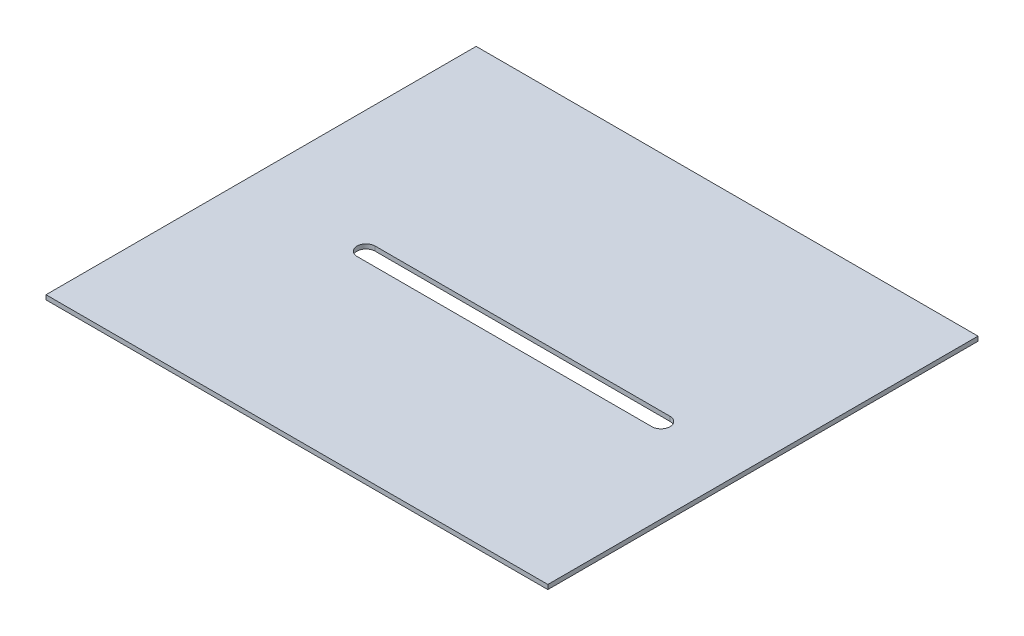
ISO-10303-21;
HEADER;
FILE_DESCRIPTION(('STEP AP214'),'2;1');
FILE_NAME('part.step','',(''),(''),'','','');
FILE_SCHEMA(('AUTOMOTIVE_DESIGN { 1 0 10303 214 1 1 1 1 }'));
ENDSEC;
DATA;
#1=APPLICATION_CONTEXT('core data for automotive mechanical design processes');
#2=APPLICATION_PROTOCOL_DEFINITION('international standard','automotive_design',2000,#1);
#3=PRODUCT_CONTEXT('',#1,'mechanical');
#4=PRODUCT('Part','Part','',(#3));
#5=PRODUCT_RELATED_PRODUCT_CATEGORY('part','',(#4));
#6=PRODUCT_DEFINITION_FORMATION('','',#4);
#7=PRODUCT_DEFINITION_CONTEXT('part definition',#1,'design');
#8=PRODUCT_DEFINITION('design','',#6,#7);
#9=PRODUCT_DEFINITION_SHAPE('','',#8);
#10=(LENGTH_UNIT() NAMED_UNIT(*) SI_UNIT(.MILLI.,.METRE.));
#11=(NAMED_UNIT(*) PLANE_ANGLE_UNIT() SI_UNIT($,.RADIAN.));
#12=(NAMED_UNIT(*) SI_UNIT($,.STERADIAN.) SOLID_ANGLE_UNIT());
#13=UNCERTAINTY_MEASURE_WITH_UNIT(LENGTH_MEASURE(1.E-05),#10,'distance_accuracy_value','');
#14=(GEOMETRIC_REPRESENTATION_CONTEXT(3) GLOBAL_UNCERTAINTY_ASSIGNED_CONTEXT((#13)) GLOBAL_UNIT_ASSIGNED_CONTEXT((#10,
#11,#12)) REPRESENTATION_CONTEXT('',''));
#15=CARTESIAN_POINT('',(0.,0.,0.));
#16=DIRECTION('',(0.,0.,1.));
#17=DIRECTION('',(1.,0.,0.));
#18=AXIS2_PLACEMENT_3D('',#15,#16,#17);
#19=CARTESIAN_POINT('',(0.,3.175,0.));
#20=DIRECTION('',(0.,-1.,0.));
#21=DIRECTION('',(0.,0.,-1.));
#22=AXIS2_PLACEMENT_3D('',#19,#20,#21);
#23=PLANE('',#22);
#24=DIRECTION('',(0.,0.,1.));
#25=VECTOR('',#24,1.);
#26=CARTESIAN_POINT('',(0.,3.175,0.));
#27=LINE('',#26,#25);
#28=CARTESIAN_POINT('',(0.,3.175,-304.8));
#29=VERTEX_POINT('',#28);
#30=CARTESIAN_POINT('',(0.,3.175,0.));
#31=VERTEX_POINT('',#30);
#32=EDGE_CURVE('E134',#29,#31,#27,.T.);
#33=ORIENTED_EDGE('',*,*,#32,.T.);
#34=DIRECTION('',(1.,0.,0.));
#35=VECTOR('',#34,1.);
#36=CARTESIAN_POINT('',(0.,3.175,0.));
#37=LINE('',#36,#35);
#38=CARTESIAN_POINT('',(355.6,3.175,0.));
#39=VERTEX_POINT('',#38);
#40=EDGE_CURVE('E137',#31,#39,#37,.T.);
#41=ORIENTED_EDGE('',*,*,#40,.T.);
#42=DIRECTION('',(0.,0.,-1.));
#43=VECTOR('',#42,1.);
#44=CARTESIAN_POINT('',(355.6,3.175,0.));
#45=LINE('',#44,#43);
#46=CARTESIAN_POINT('',(355.6,3.175,-304.8));
#47=VERTEX_POINT('',#46);
#48=EDGE_CURVE('E140',#39,#47,#45,.T.);
#49=ORIENTED_EDGE('',*,*,#48,.T.);
#50=DIRECTION('',(-1.,0.,0.));
#51=VECTOR('',#50,1.);
#52=CARTESIAN_POINT('',(0.,3.175,-304.8));
#53=LINE('',#52,#51);
#54=EDGE_CURVE('E142',#47,#29,#53,.T.);
#55=ORIENTED_EDGE('',*,*,#54,.T.);
#56=EDGE_LOOP('',(#33,#41,#49,#55));
#57=FACE_BOUND('',#56,.T.);
#58=CARTESIAN_POINT('',(295.660266997729,3.175,-140.090080016851));
#59=DIRECTION('',(0.,1.,0.));
#60=DIRECTION('',(0.,0.,1.));
#61=AXIS2_PLACEMENT_3D('',#58,#59,#60);
#62=CIRCLE('',#61,6.41055384885193);
#63=CARTESIAN_POINT('',(295.660266997729,3.175,-133.679526167999));
#64=VERTEX_POINT('',#63);
#65=CARTESIAN_POINT('',(295.660266997729,3.175,-146.500633865703));
#66=VERTEX_POINT('',#65);
#67=EDGE_CURVE('E98',#64,#66,#62,.T.);
#68=ORIENTED_EDGE('',*,*,#67,.F.);
#69=DIRECTION('',(1.,0.,0.));
#70=VECTOR('',#69,1.);
#71=CARTESIAN_POINT('',(295.660266997729,3.175,-133.679526167999));
#72=LINE('',#71,#70);
#73=CARTESIAN_POINT('',(86.717406579238,3.175,-133.679526167999));
#74=VERTEX_POINT('',#73);
#75=EDGE_CURVE('E120',#74,#64,#72,.T.);
#76=ORIENTED_EDGE('',*,*,#75,.F.);
#77=CARTESIAN_POINT('',(86.717406579238,3.175,-140.090080016851));
#78=DIRECTION('',(0.,1.,0.));
#79=DIRECTION('',(0.,0.,1.));
#80=AXIS2_PLACEMENT_3D('',#77,#78,#79);
#81=CIRCLE('',#80,6.4105538488519);
#82=CARTESIAN_POINT('',(86.717406579238,3.175,-146.500633865703));
#83=VERTEX_POINT('',#82);
#84=EDGE_CURVE('E118',#83,#74,#81,.T.);
#85=ORIENTED_EDGE('',*,*,#84,.F.);
#86=DIRECTION('',(-1.,0.,0.));
#87=VECTOR('',#86,1.);
#88=CARTESIAN_POINT('',(295.660266997729,3.175,-146.500633865703));
#89=LINE('',#88,#87);
#90=EDGE_CURVE('E106',#66,#83,#89,.T.);
#91=ORIENTED_EDGE('',*,*,#90,.F.);
#92=EDGE_LOOP('',(#68,#76,#85,#91));
#93=FACE_BOUND('',#92,.T.);
#94=ADVANCED_FACE('F33',(#57,#93),#23,.F.);
#95=CARTESIAN_POINT('',(0.,0.,0.));
#96=DIRECTION('',(0.,-1.,0.));
#97=DIRECTION('',(0.,0.,-1.));
#98=AXIS2_PLACEMENT_3D('',#95,#96,#97);
#99=PLANE('',#98);
#100=DIRECTION('',(0.,0.,1.));
#101=VECTOR('',#100,1.);
#102=CARTESIAN_POINT('',(0.,0.,0.));
#103=LINE('',#102,#101);
#104=CARTESIAN_POINT('',(0.,0.,-304.8));
#105=VERTEX_POINT('',#104);
#106=CARTESIAN_POINT('',(0.,0.,0.));
#107=VERTEX_POINT('',#106);
#108=EDGE_CURVE('E114',#105,#107,#103,.T.);
#109=ORIENTED_EDGE('',*,*,#108,.F.);
#110=DIRECTION('',(-1.,0.,0.));
#111=VECTOR('',#110,1.);
#112=CARTESIAN_POINT('',(0.,0.,-304.8));
#113=LINE('',#112,#111);
#114=CARTESIAN_POINT('',(355.6,0.,-304.8));
#115=VERTEX_POINT('',#114);
#116=EDGE_CURVE('E138',#115,#105,#113,.T.);
#117=ORIENTED_EDGE('',*,*,#116,.F.);
#118=DIRECTION('',(0.,0.,-1.));
#119=VECTOR('',#118,1.);
#120=CARTESIAN_POINT('',(355.6,0.,0.));
#121=LINE('',#120,#119);
#122=CARTESIAN_POINT('',(355.6,0.,0.));
#123=VERTEX_POINT('',#122);
#124=EDGE_CURVE('E149',#123,#115,#121,.T.);
#125=ORIENTED_EDGE('',*,*,#124,.F.);
#126=DIRECTION('',(1.,0.,0.));
#127=VECTOR('',#126,1.);
#128=CARTESIAN_POINT('',(0.,0.,0.));
#129=LINE('',#128,#127);
#130=EDGE_CURVE('E147',#107,#123,#129,.T.);
#131=ORIENTED_EDGE('',*,*,#130,.F.);
#132=EDGE_LOOP('',(#109,#117,#125,#131));
#133=FACE_BOUND('',#132,.T.);
#134=DIRECTION('',(1.,0.,0.));
#135=VECTOR('',#134,1.);
#136=CARTESIAN_POINT('',(295.660266997729,0.,-133.679526167999));
#137=LINE('',#136,#135);
#138=CARTESIAN_POINT('',(86.717406579238,0.,-133.679526167999));
#139=VERTEX_POINT('',#138);
#140=CARTESIAN_POINT('',(295.660266997729,0.,-133.679526167999));
#141=VERTEX_POINT('',#140);
#142=EDGE_CURVE('E107',#139,#141,#137,.T.);
#143=ORIENTED_EDGE('',*,*,#142,.T.);
#144=CARTESIAN_POINT('',(295.660266997729,0.,-140.090080016851));
#145=DIRECTION('',(0.,1.,0.));
#146=DIRECTION('',(0.,0.,1.));
#147=AXIS2_PLACEMENT_3D('',#144,#145,#146);
#148=CIRCLE('',#147,6.41055384885193);
#149=CARTESIAN_POINT('',(295.660266997729,0.,-146.500633865703));
#150=VERTEX_POINT('',#149);
#151=EDGE_CURVE('E56',#141,#150,#148,.T.);
#152=ORIENTED_EDGE('',*,*,#151,.T.);
#153=DIRECTION('',(-1.,0.,0.));
#154=VECTOR('',#153,1.);
#155=CARTESIAN_POINT('',(295.660266997729,0.,-146.500633865703));
#156=LINE('',#155,#154);
#157=CARTESIAN_POINT('',(86.717406579238,0.,-146.500633865703));
#158=VERTEX_POINT('',#157);
#159=EDGE_CURVE('E113',#150,#158,#156,.T.);
#160=ORIENTED_EDGE('',*,*,#159,.T.);
#161=CARTESIAN_POINT('',(86.717406579238,0.,-140.090080016851));
#162=DIRECTION('',(0.,1.,0.));
#163=DIRECTION('',(0.,0.,1.));
#164=AXIS2_PLACEMENT_3D('',#161,#162,#163);
#165=CIRCLE('',#164,6.4105538488519);
#166=EDGE_CURVE('E126',#158,#139,#165,.T.);
#167=ORIENTED_EDGE('',*,*,#166,.T.);
#168=EDGE_LOOP('',(#143,#152,#160,#167));
#169=FACE_BOUND('',#168,.T.);
#170=ADVANCED_FACE('F167',(#133,#169),#99,.T.);
#171=CARTESIAN_POINT('',(0.,3.175,0.));
#172=DIRECTION('',(1.,0.,0.));
#173=DIRECTION('',(0.,0.,-1.));
#174=AXIS2_PLACEMENT_3D('',#171,#172,#173);
#175=PLANE('',#174);
#176=ORIENTED_EDGE('',*,*,#108,.T.);
#177=DIRECTION('',(0.,-1.,0.));
#178=VECTOR('',#177,1.);
#179=CARTESIAN_POINT('',(0.,3.175,0.));
#180=LINE('',#179,#178);
#181=EDGE_CURVE('E11',#31,#107,#180,.T.);
#182=ORIENTED_EDGE('',*,*,#181,.F.);
#183=ORIENTED_EDGE('',*,*,#32,.F.);
#184=DIRECTION('',(0.,-1.,0.));
#185=VECTOR('',#184,1.);
#186=CARTESIAN_POINT('',(0.,3.175,-304.8));
#187=LINE('',#186,#185);
#188=EDGE_CURVE('E144',#29,#105,#187,.T.);
#189=ORIENTED_EDGE('',*,*,#188,.T.);
#190=EDGE_LOOP('',(#176,#182,#183,#189));
#191=FACE_BOUND('',#190,.T.);
#192=ADVANCED_FACE('F35',(#191),#175,.F.);
#193=CARTESIAN_POINT('',(0.,3.175,0.));
#194=DIRECTION('',(0.,0.,-1.));
#195=DIRECTION('',(-1.,0.,0.));
#196=AXIS2_PLACEMENT_3D('',#193,#194,#195);
#197=PLANE('',#196);
#198=ORIENTED_EDGE('',*,*,#130,.T.);
#199=DIRECTION('',(0.,-1.,0.));
#200=VECTOR('',#199,1.);
#201=CARTESIAN_POINT('',(355.6,3.175,0.));
#202=LINE('',#201,#200);
#203=EDGE_CURVE('E41',#39,#123,#202,.T.);
#204=ORIENTED_EDGE('',*,*,#203,.F.);
#205=ORIENTED_EDGE('',*,*,#40,.F.);
#206=ORIENTED_EDGE('',*,*,#181,.T.);
#207=EDGE_LOOP('',(#198,#204,#205,#206));
#208=FACE_BOUND('',#207,.T.);
#209=ADVANCED_FACE('F177',(#208),#197,.F.);
#210=CARTESIAN_POINT('',(355.6,3.175,0.));
#211=DIRECTION('',(-1.,0.,0.));
#212=DIRECTION('',(0.,0.,1.));
#213=AXIS2_PLACEMENT_3D('',#210,#211,#212);
#214=PLANE('',#213);
#215=ORIENTED_EDGE('',*,*,#124,.T.);
#216=DIRECTION('',(0.,-1.,0.));
#217=VECTOR('',#216,1.);
#218=CARTESIAN_POINT('',(355.6,3.175,-304.8));
#219=LINE('',#218,#217);
#220=EDGE_CURVE('E154',#47,#115,#219,.T.);
#221=ORIENTED_EDGE('',*,*,#220,.F.);
#222=ORIENTED_EDGE('',*,*,#48,.F.);
#223=ORIENTED_EDGE('',*,*,#203,.T.);
#224=EDGE_LOOP('',(#215,#221,#222,#223));
#225=FACE_BOUND('',#224,.T.);
#226=ADVANCED_FACE('F161',(#225),#214,.F.);
#227=CARTESIAN_POINT('',(0.,3.175,-304.8));
#228=DIRECTION('',(0.,0.,1.));
#229=DIRECTION('',(1.,0.,0.));
#230=AXIS2_PLACEMENT_3D('',#227,#228,#229);
#231=PLANE('',#230);
#232=ORIENTED_EDGE('',*,*,#116,.T.);
#233=ORIENTED_EDGE('',*,*,#188,.F.);
#234=ORIENTED_EDGE('',*,*,#54,.F.);
#235=ORIENTED_EDGE('',*,*,#220,.T.);
#236=EDGE_LOOP('',(#232,#233,#234,#235));
#237=FACE_BOUND('',#236,.T.);
#238=ADVANCED_FACE('F171',(#237),#231,.F.);
#239=CARTESIAN_POINT('',(295.660266997729,3.175,-140.090080016851));
#240=DIRECTION('',(0.,-1.,0.));
#241=DIRECTION('',(0.,0.,-1.));
#242=AXIS2_PLACEMENT_3D('',#239,#240,#241);
#243=CYLINDRICAL_SURFACE('',#242,6.41055384885193);
#244=ORIENTED_EDGE('',*,*,#151,.F.);
#245=DIRECTION('',(0.,-1.,0.));
#246=VECTOR('',#245,1.);
#247=CARTESIAN_POINT('',(295.660266997729,3.175,-133.679526167999));
#248=LINE('',#247,#246);
#249=EDGE_CURVE('E102',#64,#141,#248,.T.);
#250=ORIENTED_EDGE('',*,*,#249,.F.);
#251=ORIENTED_EDGE('',*,*,#67,.T.);
#252=DIRECTION('',(0.,-1.,0.));
#253=VECTOR('',#252,1.);
#254=CARTESIAN_POINT('',(295.660266997729,3.175,-146.500633865703));
#255=LINE('',#254,#253);
#256=EDGE_CURVE('E101',#66,#150,#255,.T.);
#257=ORIENTED_EDGE('',*,*,#256,.T.);
#258=EDGE_LOOP('',(#244,#250,#251,#257));
#259=FACE_BOUND('',#258,.T.);
#260=ADVANCED_FACE('F100',(#259),#243,.F.);
#261=CARTESIAN_POINT('',(295.660266997729,3.175,-146.500633865703));
#262=DIRECTION('',(0.,0.,1.));
#263=DIRECTION('',(1.,0.,0.));
#264=AXIS2_PLACEMENT_3D('',#261,#262,#263);
#265=PLANE('',#264);
#266=ORIENTED_EDGE('',*,*,#159,.F.);
#267=ORIENTED_EDGE('',*,*,#256,.F.);
#268=ORIENTED_EDGE('',*,*,#90,.T.);
#269=DIRECTION('',(0.,-1.,0.));
#270=VECTOR('',#269,1.);
#271=CARTESIAN_POINT('',(86.717406579238,3.175,-146.500633865703));
#272=LINE('',#271,#270);
#273=EDGE_CURVE('E115',#83,#158,#272,.T.);
#274=ORIENTED_EDGE('',*,*,#273,.T.);
#275=EDGE_LOOP('',(#266,#267,#268,#274));
#276=FACE_BOUND('',#275,.T.);
#277=ADVANCED_FACE('F110',(#276),#265,.T.);
#278=CARTESIAN_POINT('',(86.717406579238,3.175,-140.090080016851));
#279=DIRECTION('',(0.,-1.,0.));
#280=DIRECTION('',(0.,0.,-1.));
#281=AXIS2_PLACEMENT_3D('',#278,#279,#280);
#282=CYLINDRICAL_SURFACE('',#281,6.4105538488519);
#283=ORIENTED_EDGE('',*,*,#166,.F.);
#284=ORIENTED_EDGE('',*,*,#273,.F.);
#285=ORIENTED_EDGE('',*,*,#84,.T.);
#286=DIRECTION('',(0.,-1.,0.));
#287=VECTOR('',#286,1.);
#288=CARTESIAN_POINT('',(86.717406579238,3.175,-133.679526167999));
#289=LINE('',#288,#287);
#290=EDGE_CURVE('E48',#74,#139,#289,.T.);
#291=ORIENTED_EDGE('',*,*,#290,.T.);
#292=EDGE_LOOP('',(#283,#284,#285,#291));
#293=FACE_BOUND('',#292,.T.);
#294=ADVANCED_FACE('F200',(#293),#282,.F.);
#295=CARTESIAN_POINT('',(295.660266997729,3.175,-133.679526167999));
#296=DIRECTION('',(0.,0.,-1.));
#297=DIRECTION('',(-1.,0.,0.));
#298=AXIS2_PLACEMENT_3D('',#295,#296,#297);
#299=PLANE('',#298);
#300=ORIENTED_EDGE('',*,*,#142,.F.);
#301=ORIENTED_EDGE('',*,*,#290,.F.);
#302=ORIENTED_EDGE('',*,*,#75,.T.);
#303=ORIENTED_EDGE('',*,*,#249,.T.);
#304=EDGE_LOOP('',(#300,#301,#302,#303));
#305=FACE_BOUND('',#304,.T.);
#306=ADVANCED_FACE('F204',(#305),#299,.T.);
#307=CLOSED_SHELL('',(#94,#170,#192,#209,#226,#238,#260,#277,#294,#306));
#308=MANIFOLD_SOLID_BREP('B2',#307);
#309=ADVANCED_BREP_SHAPE_REPRESENTATION('',(#18,#308),#14);
#310=SHAPE_DEFINITION_REPRESENTATION(#9,#309);
ENDSEC;
END-ISO-10303-21;
